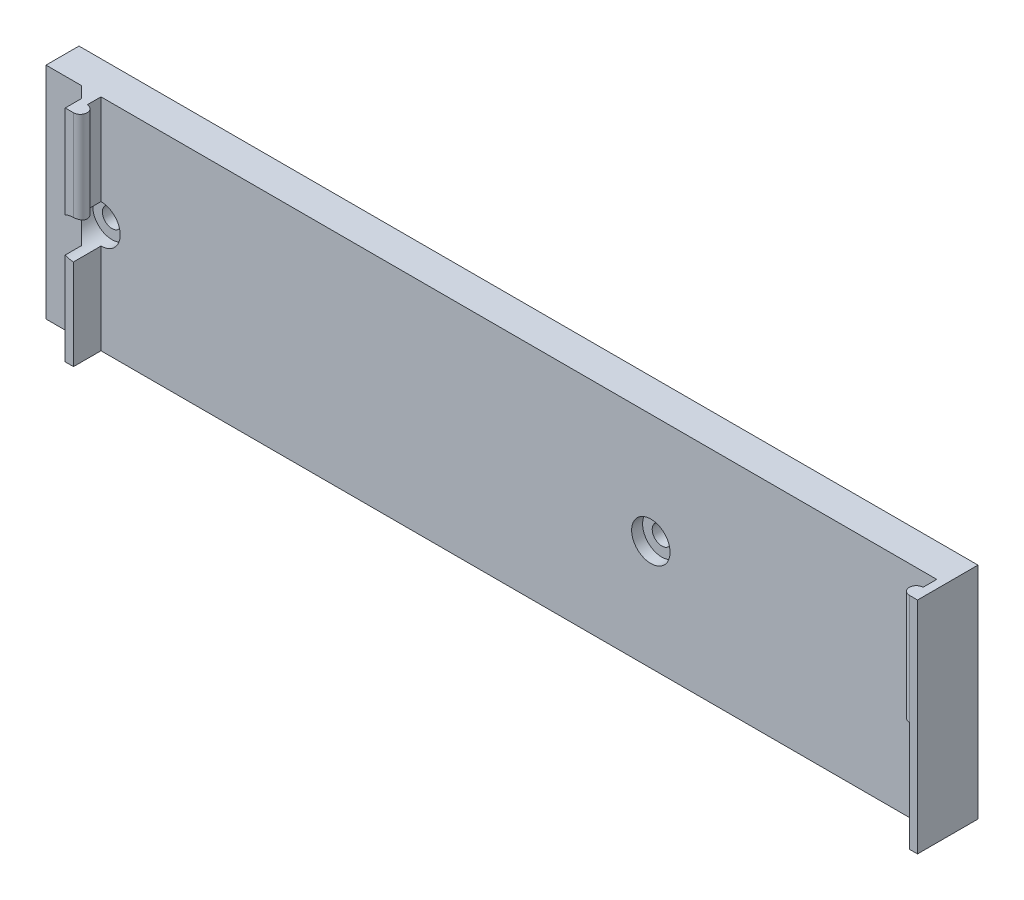
ISO-10303-21;
HEADER;
FILE_DESCRIPTION(('STEP AP214'),'2;1');
FILE_NAME('part.step','',(''),(''),'','','');
FILE_SCHEMA(('AUTOMOTIVE_DESIGN { 1 0 10303 214 1 1 1 1 }'));
ENDSEC;
DATA;
#1=APPLICATION_CONTEXT('core data for automotive mechanical design processes');
#2=APPLICATION_PROTOCOL_DEFINITION('international standard','automotive_design',2000,#1);
#3=PRODUCT_CONTEXT('',#1,'mechanical');
#4=PRODUCT('Part','Part','',(#3));
#5=PRODUCT_RELATED_PRODUCT_CATEGORY('part','',(#4));
#6=PRODUCT_DEFINITION_FORMATION('','',#4);
#7=PRODUCT_DEFINITION_CONTEXT('part definition',#1,'design');
#8=PRODUCT_DEFINITION('design','',#6,#7);
#9=PRODUCT_DEFINITION_SHAPE('','',#8);
#10=(LENGTH_UNIT() NAMED_UNIT(*) SI_UNIT(.MILLI.,.METRE.));
#11=(NAMED_UNIT(*) PLANE_ANGLE_UNIT() SI_UNIT($,.RADIAN.));
#12=(NAMED_UNIT(*) SI_UNIT($,.STERADIAN.) SOLID_ANGLE_UNIT());
#13=UNCERTAINTY_MEASURE_WITH_UNIT(LENGTH_MEASURE(1.E-05),#10,'distance_accuracy_value','');
#14=(GEOMETRIC_REPRESENTATION_CONTEXT(3) GLOBAL_UNCERTAINTY_ASSIGNED_CONTEXT((#13)) GLOBAL_UNIT_ASSIGNED_CONTEXT((#10,
#11,#12)) REPRESENTATION_CONTEXT('',''));
#15=CARTESIAN_POINT('',(0.,0.,0.));
#16=DIRECTION('',(0.,0.,1.));
#17=DIRECTION('',(1.,0.,0.));
#18=AXIS2_PLACEMENT_3D('',#15,#16,#17);
#19=CARTESIAN_POINT('',(-76.,0.,11.));
#20=DIRECTION('',(1.,0.,0.));
#21=DIRECTION('',(0.,0.,-1.));
#22=AXIS2_PLACEMENT_3D('',#19,#20,#21);
#23=PLANE('',#22);
#24=DIRECTION('',(0.,-1.,0.));
#25=VECTOR('',#24,1.);
#26=CARTESIAN_POINT('',(-76.,0.,11.));
#27=LINE('',#26,#25);
#28=CARTESIAN_POINT('',(-76.,11.5,11.));
#29=VERTEX_POINT('',#28);
#30=CARTESIAN_POINT('',(-76.,-5.00000000000002,11.));
#31=VERTEX_POINT('',#30);
#32=EDGE_CURVE('E216',#29,#31,#27,.T.);
#33=ORIENTED_EDGE('',*,*,#32,.T.);
#34=DIRECTION('',(0.,0.,1.));
#35=VECTOR('',#34,1.);
#36=CARTESIAN_POINT('',(-76.,-5.00000000000002,6.));
#37=LINE('',#36,#35);
#38=CARTESIAN_POINT('',(-76.,-5.00000000000002,6.));
#39=VERTEX_POINT('',#38);
#40=EDGE_CURVE('E477',#39,#31,#37,.T.);
#41=ORIENTED_EDGE('',*,*,#40,.F.);
#42=DIRECTION('',(0.,-1.,0.));
#43=VECTOR('',#42,1.);
#44=CARTESIAN_POINT('',(-76.,0.,6.));
#45=LINE('',#44,#43);
#46=CARTESIAN_POINT('',(-76.,11.5,6.));
#47=VERTEX_POINT('',#46);
#48=EDGE_CURVE('E210',#47,#39,#45,.T.);
#49=ORIENTED_EDGE('',*,*,#48,.F.);
#50=DIRECTION('',(0.,0.,-1.));
#51=VECTOR('',#50,1.);
#52=CARTESIAN_POINT('',(-76.,11.5,11.));
#53=LINE('',#52,#51);
#54=EDGE_CURVE('E387',#47,#29,#53,.F.);
#55=ORIENTED_EDGE('',*,*,#54,.T.);
#56=EDGE_LOOP('',(#33,#41,#49,#55));
#57=FACE_BOUND('',#56,.T.);
#58=ADVANCED_FACE('F43',(#57),#23,.T.);
#59=CARTESIAN_POINT('',(-77.5,-35.,6.));
#60=DIRECTION('',(1.,0.,0.));
#61=DIRECTION('',(0.,0.,-1.));
#62=AXIS2_PLACEMENT_3D('',#59,#60,#61);
#63=PLANE('',#62);
#64=DIRECTION('',(0.,0.,-1.));
#65=VECTOR('',#64,1.);
#66=CARTESIAN_POINT('',(-77.5,-5.00000000000002,11.));
#67=LINE('',#66,#65);
#68=CARTESIAN_POINT('',(-77.5,-5.00000000000002,11.));
#69=VERTEX_POINT('',#68);
#70=CARTESIAN_POINT('',(-77.5,-5.00000000000072,8.00000000000003));
#71=VERTEX_POINT('',#70);
#72=EDGE_CURVE('E60',#69,#71,#67,.T.);
#73=ORIENTED_EDGE('',*,*,#72,.F.);
#74=DIRECTION('',(0.,-1.,0.));
#75=VECTOR('',#74,1.);
#76=CARTESIAN_POINT('',(-77.5,0.,11.));
#77=LINE('',#76,#75);
#78=CARTESIAN_POINT('',(-77.5,11.8377223398316,11.));
#79=VERTEX_POINT('',#78);
#80=EDGE_CURVE('E220',#79,#69,#77,.T.);
#81=ORIENTED_EDGE('',*,*,#80,.F.);
#82=DIRECTION('',(0.,0.,-1.));
#83=VECTOR('',#82,1.);
#84=CARTESIAN_POINT('',(-77.5,11.8377223398316,11.));
#85=LINE('',#84,#83);
#86=CARTESIAN_POINT('',(-77.5,11.8377223398316,8.00000000000003));
#87=VERTEX_POINT('',#86);
#88=EDGE_CURVE('E383',#87,#79,#85,.F.);
#89=ORIENTED_EDGE('',*,*,#88,.F.);
#90=DIRECTION('',(0.,-1.,0.));
#91=VECTOR('',#90,1.);
#92=CARTESIAN_POINT('',(-77.5,-35.,8.00000000000003));
#93=LINE('',#92,#91);
#94=EDGE_CURVE('E249',#87,#71,#93,.T.);
#95=ORIENTED_EDGE('',*,*,#94,.T.);
#96=EDGE_LOOP('',(#73,#81,#89,#95));
#97=FACE_BOUND('',#96,.T.);
#98=ADVANCED_FACE('F349',(#97),#63,.F.);
#99=CARTESIAN_POINT('',(0.,0.,6.));
#100=DIRECTION('',(0.,0.,1.));
#101=DIRECTION('',(1.,0.,0.));
#102=AXIS2_PLACEMENT_3D('',#99,#100,#101);
#103=PLANE('',#102);
#104=CARTESIAN_POINT('',(24.,15.,6.));
#105=DIRECTION('',(0.,0.,1.));
#106=DIRECTION('',(1.,0.,0.));
#107=AXIS2_PLACEMENT_3D('',#104,#105,#106);
#108=CIRCLE('',#107,3.5);
#109=CARTESIAN_POINT('',(27.5,15.,6.));
#110=VERTEX_POINT('',#109);
#111=EDGE_CURVE('E497',#110,#110,#108,.T.);
#112=ORIENTED_EDGE('',*,*,#111,.F.);
#113=EDGE_LOOP('',(#112));
#114=FACE_BOUND('',#113,.T.);
#115=ORIENTED_EDGE('',*,*,#48,.T.);
#116=DIRECTION('',(-1.,0.,0.));
#117=VECTOR('',#116,1.);
#118=CARTESIAN_POINT('',(76.,-5.,6.));
#119=LINE('',#118,#117);
#120=CARTESIAN_POINT('',(76.,-5.,6.));
#121=VERTEX_POINT('',#120);
#122=EDGE_CURVE('E187',#121,#39,#119,.T.);
#123=ORIENTED_EDGE('',*,*,#122,.F.);
#124=DIRECTION('',(0.,1.,0.));
#125=VECTOR('',#124,1.);
#126=CARTESIAN_POINT('',(76.,0.,6.));
#127=LINE('',#126,#125);
#128=CARTESIAN_POINT('',(76.,35.,6.));
#129=VERTEX_POINT('',#128);
#130=EDGE_CURVE('E185',#121,#129,#127,.T.);
#131=ORIENTED_EDGE('',*,*,#130,.T.);
#132=DIRECTION('',(-1.,0.,0.));
#133=VECTOR('',#132,1.);
#134=CARTESIAN_POINT('',(77.5,35.,6.));
#135=LINE('',#134,#133);
#136=CARTESIAN_POINT('',(-76.,35.,6.));
#137=VERTEX_POINT('',#136);
#138=EDGE_CURVE('E233',#129,#137,#135,.T.);
#139=ORIENTED_EDGE('',*,*,#138,.T.);
#140=CARTESIAN_POINT('',(-76.,18.5,6.));
#141=VERTEX_POINT('',#140);
#142=EDGE_CURVE('E226',#137,#141,#45,.T.);
#143=ORIENTED_EDGE('',*,*,#142,.T.);
#144=CARTESIAN_POINT('',(-76.,15.,6.));
#145=DIRECTION('',(0.,0.,1.));
#146=DIRECTION('',(1.,0.,0.));
#147=AXIS2_PLACEMENT_3D('',#144,#145,#146);
#148=CIRCLE('',#147,3.5);
#149=EDGE_CURVE('E489',#47,#141,#148,.T.);
#150=ORIENTED_EDGE('',*,*,#149,.F.);
#151=EDGE_LOOP('',(#115,#123,#131,#139,#143,#150));
#152=FACE_BOUND('',#151,.T.);
#153=ADVANCED_FACE('F356',(#114,#152),#103,.T.);
#154=CARTESIAN_POINT('',(77.5,-35.,6.));
#155=DIRECTION('',(-1.,0.,0.));
#156=DIRECTION('',(0.,0.,1.));
#157=AXIS2_PLACEMENT_3D('',#154,#155,#156);
#158=PLANE('',#157);
#159=DIRECTION('',(0.,0.,1.));
#160=VECTOR('',#159,1.);
#161=CARTESIAN_POINT('',(77.5,-5.,0.));
#162=LINE('',#161,#160);
#163=CARTESIAN_POINT('',(77.5,-5.,0.));
#164=VERTEX_POINT('',#163);
#165=CARTESIAN_POINT('',(77.5,-5.,11.));
#166=VERTEX_POINT('',#165);
#167=EDGE_CURVE('E173',#164,#166,#162,.T.);
#168=ORIENTED_EDGE('',*,*,#167,.F.);
#169=DIRECTION('',(0.,1.,0.));
#170=VECTOR('',#169,1.);
#171=CARTESIAN_POINT('',(77.5,-35.,0.));
#172=LINE('',#171,#170);
#173=CARTESIAN_POINT('',(77.5,35.,0.));
#174=VERTEX_POINT('',#173);
#175=EDGE_CURVE('E232',#164,#174,#172,.T.);
#176=ORIENTED_EDGE('',*,*,#175,.T.);
#177=DIRECTION('',(0.,0.,-1.));
#178=VECTOR('',#177,1.);
#179=CARTESIAN_POINT('',(77.5,35.,6.));
#180=LINE('',#179,#178);
#181=CARTESIAN_POINT('',(77.5,35.,11.));
#182=VERTEX_POINT('',#181);
#183=EDGE_CURVE('E245',#182,#174,#180,.T.);
#184=ORIENTED_EDGE('',*,*,#183,.F.);
#185=DIRECTION('',(0.,1.,0.));
#186=VECTOR('',#185,1.);
#187=CARTESIAN_POINT('',(77.5,0.,11.));
#188=LINE('',#187,#186);
#189=EDGE_CURVE('E194',#166,#182,#188,.T.);
#190=ORIENTED_EDGE('',*,*,#189,.F.);
#191=EDGE_LOOP('',(#168,#176,#184,#190));
#192=FACE_BOUND('',#191,.T.);
#193=ADVANCED_FACE('F442',(#192),#158,.F.);
#194=CARTESIAN_POINT('',(0.,0.,0.));
#195=DIRECTION('',(0.,0.,1.));
#196=DIRECTION('',(1.,0.,0.));
#197=AXIS2_PLACEMENT_3D('',#194,#195,#196);
#198=PLANE('',#197);
#199=CARTESIAN_POINT('',(24.,15.,0.));
#200=DIRECTION('',(0.,0.,-1.));
#201=DIRECTION('',(-1.,0.,0.));
#202=AXIS2_PLACEMENT_3D('',#199,#200,#201);
#203=CIRCLE('',#202,1.75);
#204=CARTESIAN_POINT('',(22.25,15.,0.));
#205=VERTEX_POINT('',#204);
#206=EDGE_CURVE('E300',#205,#205,#203,.T.);
#207=ORIENTED_EDGE('',*,*,#206,.F.);
#208=EDGE_LOOP('',(#207));
#209=FACE_BOUND('',#208,.T.);
#210=CARTESIAN_POINT('',(-76.,15.,0.));
#211=DIRECTION('',(0.,0.,-1.));
#212=DIRECTION('',(-1.,0.,0.));
#213=AXIS2_PLACEMENT_3D('',#210,#211,#212);
#214=CIRCLE('',#213,1.75);
#215=CARTESIAN_POINT('',(-77.75,15.,0.));
#216=VERTEX_POINT('',#215);
#217=EDGE_CURVE('E294',#216,#216,#214,.T.);
#218=ORIENTED_EDGE('',*,*,#217,.F.);
#219=EDGE_LOOP('',(#218));
#220=FACE_BOUND('',#219,.T.);
#221=DIRECTION('',(1.,0.,0.));
#222=VECTOR('',#221,1.);
#223=CARTESIAN_POINT('',(-86.,-5.00000000000002,0.));
#224=LINE('',#223,#222);
#225=CARTESIAN_POINT('',(-86.,-5.00000000000002,0.));
#226=VERTEX_POINT('',#225);
#227=EDGE_CURVE('E460',#226,#164,#224,.T.);
#228=ORIENTED_EDGE('',*,*,#227,.F.);
#229=DIRECTION('',(0.,-1.,0.));
#230=VECTOR('',#229,1.);
#231=CARTESIAN_POINT('',(-86.,0.,0.));
#232=LINE('',#231,#230);
#233=CARTESIAN_POINT('',(-86.,35.,0.));
#234=VERTEX_POINT('',#233);
#235=EDGE_CURVE('E303',#234,#226,#232,.T.);
#236=ORIENTED_EDGE('',*,*,#235,.F.);
#237=DIRECTION('',(-1.,0.,0.));
#238=VECTOR('',#237,1.);
#239=CARTESIAN_POINT('',(77.5,35.,0.));
#240=LINE('',#239,#238);
#241=EDGE_CURVE('E238',#174,#234,#240,.T.);
#242=ORIENTED_EDGE('',*,*,#241,.F.);
#243=ORIENTED_EDGE('',*,*,#175,.F.);
#244=EDGE_LOOP('',(#228,#236,#242,#243));
#245=FACE_BOUND('',#244,.T.);
#246=ADVANCED_FACE('F437',(#209,#220,#245),#198,.F.);
#247=CARTESIAN_POINT('',(0.,0.,11.));
#248=DIRECTION('',(0.,0.,1.));
#249=DIRECTION('',(1.,0.,0.));
#250=AXIS2_PLACEMENT_3D('',#247,#248,#249);
#251=PLANE('',#250);
#252=ORIENTED_EDGE('',*,*,#80,.T.);
#253=DIRECTION('',(-1.,0.,0.));
#254=VECTOR('',#253,1.);
#255=CARTESIAN_POINT('',(-76.,-5.00000000000002,11.));
#256=LINE('',#255,#254);
#257=EDGE_CURVE('E474',#31,#69,#256,.T.);
#258=ORIENTED_EDGE('',*,*,#257,.F.);
#259=ORIENTED_EDGE('',*,*,#32,.F.);
#260=CARTESIAN_POINT('',(-76.,15.,11.));
#261=DIRECTION('',(0.,0.,1.));
#262=DIRECTION('',(1.,0.,0.));
#263=AXIS2_PLACEMENT_3D('',#260,#261,#262);
#264=CIRCLE('',#263,3.50000000000001);
#265=EDGE_CURVE('E455',#79,#29,#264,.T.);
#266=ORIENTED_EDGE('',*,*,#265,.F.);
#267=EDGE_LOOP('',(#252,#258,#259,#266));
#268=FACE_BOUND('',#267,.T.);
#269=ADVANCED_FACE('F434',(#268),#251,.T.);
#270=CARTESIAN_POINT('',(76.,0.,11.));
#271=DIRECTION('',(-1.,0.,0.));
#272=DIRECTION('',(0.,0.,1.));
#273=AXIS2_PLACEMENT_3D('',#270,#271,#272);
#274=PLANE('',#273);
#275=ORIENTED_EDGE('',*,*,#130,.F.);
#276=DIRECTION('',(0.,0.,-1.));
#277=VECTOR('',#276,1.);
#278=CARTESIAN_POINT('',(76.,-5.,11.));
#279=LINE('',#278,#277);
#280=CARTESIAN_POINT('',(76.,-5.,11.));
#281=VERTEX_POINT('',#280);
#282=EDGE_CURVE('E170',#281,#121,#279,.T.);
#283=ORIENTED_EDGE('',*,*,#282,.F.);
#284=DIRECTION('',(0.,1.,0.));
#285=VECTOR('',#284,1.);
#286=CARTESIAN_POINT('',(76.,0.,11.));
#287=LINE('',#286,#285);
#288=CARTESIAN_POINT('',(76.,15.,11.));
#289=VERTEX_POINT('',#288);
#290=EDGE_CURVE('E182',#281,#289,#287,.T.);
#291=ORIENTED_EDGE('',*,*,#290,.T.);
#292=DIRECTION('',(0.,0.,1.));
#293=VECTOR('',#292,1.);
#294=CARTESIAN_POINT('',(76.,15.,0.));
#295=LINE('',#294,#293);
#296=CARTESIAN_POINT('',(76.,15.,8.5));
#297=VERTEX_POINT('',#296);
#298=EDGE_CURVE('E316',#297,#289,#295,.T.);
#299=ORIENTED_EDGE('',*,*,#298,.F.);
#300=DIRECTION('',(0.,1.,0.));
#301=VECTOR('',#300,1.);
#302=CARTESIAN_POINT('',(76.,15.,8.5));
#303=LINE('',#302,#301);
#304=CARTESIAN_POINT('',(76.,35.,8.5));
#305=VERTEX_POINT('',#304);
#306=EDGE_CURVE('E202',#297,#305,#303,.T.);
#307=ORIENTED_EDGE('',*,*,#306,.T.);
#308=DIRECTION('',(0.,0.,-1.));
#309=VECTOR('',#308,1.);
#310=CARTESIAN_POINT('',(76.,35.,11.));
#311=LINE('',#310,#309);
#312=EDGE_CURVE('E206',#305,#129,#311,.T.);
#313=ORIENTED_EDGE('',*,*,#312,.T.);
#314=EDGE_LOOP('',(#275,#283,#291,#299,#307,#313));
#315=FACE_BOUND('',#314,.T.);
#316=ADVANCED_FACE('F181',(#315),#274,.T.);
#317=CARTESIAN_POINT('',(0.,0.,11.));
#318=DIRECTION('',(0.,0.,1.));
#319=DIRECTION('',(1.,0.,0.));
#320=AXIS2_PLACEMENT_3D('',#317,#318,#319);
#321=PLANE('',#320);
#322=ORIENTED_EDGE('',*,*,#290,.F.);
#323=DIRECTION('',(-1.,0.,0.));
#324=VECTOR('',#323,1.);
#325=CARTESIAN_POINT('',(77.5,-5.,11.));
#326=LINE('',#325,#324);
#327=EDGE_CURVE('E167',#166,#281,#326,.T.);
#328=ORIENTED_EDGE('',*,*,#327,.F.);
#329=ORIENTED_EDGE('',*,*,#189,.T.);
#330=DIRECTION('',(-1.,0.,0.));
#331=VECTOR('',#330,1.);
#332=CARTESIAN_POINT('',(0.,35.,11.));
#333=LINE('',#332,#331);
#334=CARTESIAN_POINT('',(76.,35.,11.));
#335=VERTEX_POINT('',#334);
#336=EDGE_CURVE('E198',#182,#335,#333,.T.);
#337=ORIENTED_EDGE('',*,*,#336,.T.);
#338=DIRECTION('',(0.,1.,0.));
#339=VECTOR('',#338,1.);
#340=CARTESIAN_POINT('',(76.,15.,11.));
#341=LINE('',#340,#339);
#342=EDGE_CURVE('E191',#289,#335,#341,.T.);
#343=ORIENTED_EDGE('',*,*,#342,.F.);
#344=EDGE_LOOP('',(#322,#328,#329,#337,#343));
#345=FACE_BOUND('',#344,.T.);
#346=ADVANCED_FACE('F189',(#345),#321,.T.);
#347=CARTESIAN_POINT('',(0.,0.,6.));
#348=DIRECTION('',(0.,0.,1.));
#349=DIRECTION('',(1.,0.,0.));
#350=AXIS2_PLACEMENT_3D('',#347,#348,#349);
#351=PLANE('',#350);
#352=DIRECTION('',(0.,-1.,0.));
#353=VECTOR('',#352,1.);
#354=CARTESIAN_POINT('',(-86.,0.,6.00000000000001));
#355=LINE('',#354,#353);
#356=CARTESIAN_POINT('',(-86.,35.,6.00000000000001));
#357=VERTEX_POINT('',#356);
#358=CARTESIAN_POINT('',(-86.,-5.00000000000002,6.00000000000001));
#359=VERTEX_POINT('',#358);
#360=EDGE_CURVE('E293',#357,#359,#355,.T.);
#361=ORIENTED_EDGE('',*,*,#360,.T.);
#362=DIRECTION('',(-1.,0.,0.));
#363=VECTOR('',#362,1.);
#364=CARTESIAN_POINT('',(-79.5,-5.00000000000002,6.00000000000001));
#365=LINE('',#364,#363);
#366=CARTESIAN_POINT('',(-79.5,-5.00000000000002,6.00000000000001));
#367=VERTEX_POINT('',#366);
#368=EDGE_CURVE('E466',#367,#359,#365,.T.);
#369=ORIENTED_EDGE('',*,*,#368,.F.);
#370=DIRECTION('',(0.,1.,0.));
#371=VECTOR('',#370,1.);
#372=CARTESIAN_POINT('',(-79.5,0.,6.));
#373=LINE('',#372,#371);
#374=CARTESIAN_POINT('',(-79.5,15.,6.));
#375=VERTEX_POINT('',#374);
#376=EDGE_CURVE('E256',#367,#375,#373,.T.);
#377=ORIENTED_EDGE('',*,*,#376,.T.);
#378=DIRECTION('',(0.,1.,0.));
#379=VECTOR('',#378,1.);
#380=CARTESIAN_POINT('',(-79.5,0.,6.));
#381=LINE('',#380,#379);
#382=CARTESIAN_POINT('',(-79.5,35.,6.00000000000001));
#383=VERTEX_POINT('',#382);
#384=EDGE_CURVE('E253',#375,#383,#381,.T.);
#385=ORIENTED_EDGE('',*,*,#384,.T.);
#386=DIRECTION('',(-1.,0.,0.));
#387=VECTOR('',#386,1.);
#388=CARTESIAN_POINT('',(0.,35.,6.00000000000001));
#389=LINE('',#388,#387);
#390=EDGE_CURVE('E285',#383,#357,#389,.T.);
#391=ORIENTED_EDGE('',*,*,#390,.T.);
#392=EDGE_LOOP('',(#361,#369,#377,#385,#391));
#393=FACE_BOUND('',#392,.T.);
#394=ADVANCED_FACE('F284',(#393),#351,.T.);
#395=CARTESIAN_POINT('',(-86.,0.,183.854575426105));
#396=DIRECTION('',(1.,0.,0.));
#397=DIRECTION('',(0.,1.,0.));
#398=AXIS2_PLACEMENT_3D('',#395,#396,#397);
#399=PLANE('',#398);
#400=DIRECTION('',(0.,0.,-1.));
#401=VECTOR('',#400,1.);
#402=CARTESIAN_POINT('',(-86.,-5.00000000000002,6.00000000000001));
#403=LINE('',#402,#401);
#404=EDGE_CURVE('E463',#359,#226,#403,.T.);
#405=ORIENTED_EDGE('',*,*,#404,.F.);
#406=ORIENTED_EDGE('',*,*,#360,.F.);
#407=DIRECTION('',(0.,0.,-1.));
#408=VECTOR('',#407,1.);
#409=CARTESIAN_POINT('',(-86.,35.,183.854575426105));
#410=LINE('',#409,#408);
#411=EDGE_CURVE('E290',#357,#234,#410,.T.);
#412=ORIENTED_EDGE('',*,*,#411,.T.);
#413=ORIENTED_EDGE('',*,*,#235,.T.);
#414=EDGE_LOOP('',(#405,#406,#412,#413));
#415=FACE_BOUND('',#414,.T.);
#416=ADVANCED_FACE('F371',(#415),#399,.F.);
#417=CARTESIAN_POINT('',(-77.5,-35.,8.00000000000003));
#418=DIRECTION('',(0.707106781186552,0.,-0.707106781186542));
#419=DIRECTION('',(0.,-1.,0.));
#420=AXIS2_PLACEMENT_3D('',#417,#418,#419);
#421=PLANE('',#420);
#422=DIRECTION('',(-0.707106781186543,0.,-0.707106781186551));
#423=VECTOR('',#422,1.);
#424=CARTESIAN_POINT('',(-77.5,-5.00000000000002,8.00000000000003));
#425=LINE('',#424,#423);
#426=EDGE_CURVE('E469',#71,#367,#425,.T.);
#427=ORIENTED_EDGE('',*,*,#426,.F.);
#428=ORIENTED_EDGE('',*,*,#94,.F.);
#429=CARTESIAN_POINT('',(-76.,15.,9.50000000000007));
#430=DIRECTION('',(0.707106781186552,0.,-0.707106781186542));
#431=DIRECTION('',(0.707106781186543,0.,0.707106781186552));
#432=AXIS2_PLACEMENT_3D('',#429,#430,#431);
#433=ELLIPSE('',#432,4.94974746830587,3.5);
#434=EDGE_CURVE('E263',#375,#87,#433,.F.);
#435=ORIENTED_EDGE('',*,*,#434,.F.);
#436=ORIENTED_EDGE('',*,*,#376,.F.);
#437=EDGE_LOOP('',(#427,#428,#435,#436));
#438=FACE_BOUND('',#437,.T.);
#439=ADVANCED_FACE('F281',(#438),#421,.F.);
#440=DIRECTION('',(0.,1.,0.));
#441=VECTOR('',#440,1.);
#442=CARTESIAN_POINT('',(-76.,15.,8.5));
#443=LINE('',#442,#441);
#444=CARTESIAN_POINT('',(-76.,18.5,8.5));
#445=VERTEX_POINT('',#444);
#446=CARTESIAN_POINT('',(-76.,35.,8.5));
#447=VERTEX_POINT('',#446);
#448=EDGE_CURVE('E312',#445,#447,#443,.T.);
#449=ORIENTED_EDGE('',*,*,#448,.F.);
#450=DIRECTION('',(0.,0.,-1.));
#451=VECTOR('',#450,1.);
#452=CARTESIAN_POINT('',(-76.,18.5,11.));
#453=LINE('',#452,#451);
#454=EDGE_CURVE('E375',#445,#141,#453,.T.);
#455=ORIENTED_EDGE('',*,*,#454,.T.);
#456=ORIENTED_EDGE('',*,*,#142,.F.);
#457=DIRECTION('',(0.,0.,-1.));
#458=VECTOR('',#457,1.);
#459=CARTESIAN_POINT('',(-76.,35.,11.));
#460=LINE('',#459,#458);
#461=EDGE_CURVE('E225',#447,#137,#460,.T.);
#462=ORIENTED_EDGE('',*,*,#461,.F.);
#463=EDGE_LOOP('',(#449,#455,#456,#462));
#464=FACE_BOUND('',#463,.T.);
#465=ADVANCED_FACE('F352',(#464),#23,.T.);
#466=DIRECTION('',(0.,0.,-1.));
#467=VECTOR('',#466,1.);
#468=CARTESIAN_POINT('',(-77.5,35.,6.));
#469=LINE('',#468,#467);
#470=CARTESIAN_POINT('',(-77.5,35.,11.));
#471=VERTEX_POINT('',#470);
#472=CARTESIAN_POINT('',(-77.5,35.,8.00000000000003));
#473=VERTEX_POINT('',#472);
#474=EDGE_CURVE('E237',#471,#473,#469,.T.);
#475=ORIENTED_EDGE('',*,*,#474,.T.);
#476=DIRECTION('',(0.,-1.,0.));
#477=VECTOR('',#476,1.);
#478=CARTESIAN_POINT('',(-77.5,-35.,8.00000000000003));
#479=LINE('',#478,#477);
#480=CARTESIAN_POINT('',(-77.5,18.1622776601683,8.00000000000003));
#481=VERTEX_POINT('',#480);
#482=EDGE_CURVE('E259',#473,#481,#479,.T.);
#483=ORIENTED_EDGE('',*,*,#482,.T.);
#484=DIRECTION('',(0.,0.,-1.));
#485=VECTOR('',#484,1.);
#486=CARTESIAN_POINT('',(-77.5,18.1622776601683,11.));
#487=LINE('',#486,#485);
#488=CARTESIAN_POINT('',(-77.5,18.1622776601683,11.));
#489=VERTEX_POINT('',#488);
#490=EDGE_CURVE('E274',#489,#481,#487,.T.);
#491=ORIENTED_EDGE('',*,*,#490,.F.);
#492=EDGE_CURVE('E221',#471,#489,#77,.T.);
#493=ORIENTED_EDGE('',*,*,#492,.F.);
#494=EDGE_LOOP('',(#475,#483,#491,#493));
#495=FACE_BOUND('',#494,.T.);
#496=ADVANCED_FACE('F359',(#495),#63,.F.);
#497=CARTESIAN_POINT('',(-76.,15.,9.75));
#498=DIRECTION('',(0.,1.,0.));
#499=DIRECTION('',(-1.,0.,0.));
#500=AXIS2_PLACEMENT_3D('',#497,#498,#499);
#501=CYLINDRICAL_SURFACE('',#500,1.25);
#502=CARTESIAN_POINT('',(-76.,18.5,8.5));
#503=CARTESIAN_POINT('',(-75.9659757904319,18.5000026683283,8.49999907683071));
#504=CARTESIAN_POINT('',(-75.9319688547805,18.4995032816792,8.50139008495954));
#505=CARTESIAN_POINT('',(-75.864217584946,18.4975289487794,8.50693175917107));
#506=CARTESIAN_POINT('',(-75.8304731865727,18.4960542490934,8.51108172777475));
#507=CARTESIAN_POINT('',(-75.7302073943591,18.4902245695908,8.5275924385276));
#508=CARTESIAN_POINT('',(-75.6643885949796,18.4844635651872,8.54401442577793));
#509=CARTESIAN_POINT('',(-75.5366547082636,18.4697918359865,8.58708958889776));
#510=CARTESIAN_POINT('',(-75.4747377608142,18.4608826256113,8.61373784602236));
#511=CARTESIAN_POINT('',(-75.3562241417227,18.440809192101,8.67643185981238));
#512=CARTESIAN_POINT('',(-75.2996305798288,18.4296436627403,8.71248306355123));
#513=CARTESIAN_POINT('',(-75.1912060790333,18.4057370816355,8.79442096281969));
#514=CARTESIAN_POINT('',(-75.1396113591823,18.392954546177,8.84060790552855));
#515=CARTESIAN_POINT('',(-75.0447105996287,18.3674680187645,8.94087143656938));
#516=CARTESIAN_POINT('',(-75.0014070313663,18.3547640513187,8.99495036891979));
#517=CARTESIAN_POINT('',(-74.922880473595,18.3304001061877,9.11170007488475));
#518=CARTESIAN_POINT('',(-74.8879809552402,18.3187900803079,9.17459986308374));
#519=CARTESIAN_POINT('',(-74.8293612147054,18.2985714206393,9.3058545348867));
#520=CARTESIAN_POINT('',(-74.8056365584818,18.289961596762,9.37420724223113));
#521=CARTESIAN_POINT('',(-74.770954515659,18.2771602545628,9.51171073731794));
#522=CARTESIAN_POINT('',(-74.7595476309359,18.2728137537401,9.58073326043892));
#523=CARTESIAN_POINT('',(-74.7484192355344,18.2685753081462,9.71984040223422));
#524=CARTESIAN_POINT('',(-74.7486936919814,18.2686818260114,9.78992464600614));
#525=CARTESIAN_POINT('',(-74.7605746424022,18.273202956084,9.92517826816106));
#526=CARTESIAN_POINT('',(-74.7715743349314,18.2773868746983,9.99041004961843));
#527=CARTESIAN_POINT('',(-74.8035960297355,18.289210512782,10.1180315991849));
#528=CARTESIAN_POINT('',(-74.8246192674017,18.2968506582217,10.1804210159368));
#529=CARTESIAN_POINT('',(-74.8764521600179,18.3148758556283,10.3018868924054));
#530=CARTESIAN_POINT('',(-74.9074289864255,18.3253072461456,10.3608848378626));
#531=CARTESIAN_POINT('',(-74.9781737204176,18.3477223570999,10.4730282359576));
#532=CARTESIAN_POINT('',(-75.0179444487767,18.3597065751175,10.5261718025031));
#533=CARTESIAN_POINT('',(-75.1079806205524,18.3847615419392,10.6284758978067));
#534=CARTESIAN_POINT('',(-75.1587350177102,18.3978541865051,10.6772016768853));
#535=CARTESIAN_POINT('',(-75.2678612729399,18.4230255783854,10.7655800316741));
#536=CARTESIAN_POINT('',(-75.3262352118476,18.4351040472505,10.8052301207113));
#537=CARTESIAN_POINT('',(-75.4499807941009,18.4570910587843,10.8747592459903));
#538=CARTESIAN_POINT('',(-75.5154353921905,18.4669685082592,10.9045008936965));
#539=CARTESIAN_POINT('',(-75.6508270205677,18.4832028361184,10.9523787560176));
#540=CARTESIAN_POINT('',(-75.7207572036335,18.4895649554513,10.9705322535262));
#541=CARTESIAN_POINT('',(-75.8261479716852,18.4958506132377,10.988344283457));
#542=CARTESIAN_POINT('',(-75.860776369585,18.4974025097797,10.9927127455016));
#543=CARTESIAN_POINT('',(-75.9302635093121,18.4994779139932,10.9985390828793));
#544=CARTESIAN_POINT('',(-75.9651219053432,18.5000027168634,11.0000006239726));
#545=CARTESIAN_POINT('',(-76.,18.5000000000001,11.0000000000002));
#546=B_SPLINE_CURVE_WITH_KNOTS('',3,(#502,#503,#504,#505,#506,#507,#508,#509,#510,#511,#512,
#513,#514,#515,#516,#517,#518,#519,#520,#521,#522,#523,#524,#525,#526,#527,#528,#529,#530,#531,
#532,#533,#534,#535,#536,#537,#538,#539,#540,#541,#542,#543,#544,#545),.UNSPECIFIED.,.F.,.F.,(4,
2,2,2,2,2,2,2,2,2,2,2,2,2,2,2,2,2,2,2,2,4),(0.,0.102006778343278,0.203987778663533,
0.407165932526253,0.610246481746047,0.813444936675671,1.02375999820424,1.23413765352075,
1.45164280743171,1.66906158520247,1.8782461980126,2.08735859236272,2.2852880405023,
2.48324188954616,2.68471130666592,2.88624544208698,3.09995801092077,3.31372906553626,
3.53035156417599,3.7466502263919,3.85134354778704,3.9559047622036),.UNSPECIFIED.);
#547=CARTESIAN_POINT('',(-76.,18.5,11.));
#548=VERTEX_POINT('',#547);
#549=EDGE_CURVE('E379',#445,#548,#546,.T.);
#550=ORIENTED_EDGE('',*,*,#549,.F.);
#551=ORIENTED_EDGE('',*,*,#448,.T.);
#552=CARTESIAN_POINT('',(-76.,35.,9.75));
#553=DIRECTION('',(0.,-1.,0.));
#554=DIRECTION('',(1.,0.,0.));
#555=AXIS2_PLACEMENT_3D('',#552,#553,#554);
#556=CIRCLE('',#555,1.25);
#557=CARTESIAN_POINT('',(-76.,35.,11.));
#558=VERTEX_POINT('',#557);
#559=EDGE_CURVE('E308',#447,#558,#556,.T.);
#560=ORIENTED_EDGE('',*,*,#559,.T.);
#561=EDGE_CURVE('E211',#558,#548,#27,.T.);
#562=ORIENTED_EDGE('',*,*,#561,.T.);
#563=EDGE_LOOP('',(#550,#551,#560,#562));
#564=FACE_BOUND('',#563,.T.);
#565=ADVANCED_FACE('F369',(#564),#501,.T.);
#566=ORIENTED_EDGE('',*,*,#492,.T.);
#567=EDGE_CURVE('E452',#548,#489,#264,.T.);
#568=ORIENTED_EDGE('',*,*,#567,.F.);
#569=ORIENTED_EDGE('',*,*,#561,.F.);
#570=DIRECTION('',(-1.,0.,0.));
#571=VECTOR('',#570,1.);
#572=CARTESIAN_POINT('',(0.,35.,11.));
#573=LINE('',#572,#571);
#574=EDGE_CURVE('E215',#558,#471,#573,.T.);
#575=ORIENTED_EDGE('',*,*,#574,.T.);
#576=EDGE_LOOP('',(#566,#568,#569,#575));
#577=FACE_BOUND('',#576,.T.);
#578=ADVANCED_FACE('F345',(#577),#251,.T.);
#579=CARTESIAN_POINT('',(77.5,35.,6.));
#580=DIRECTION('',(0.,-1.,0.));
#581=DIRECTION('',(1.,0.,0.));
#582=AXIS2_PLACEMENT_3D('',#579,#580,#581);
#583=PLANE('',#582);
#584=ORIENTED_EDGE('',*,*,#461,.T.);
#585=ORIENTED_EDGE('',*,*,#138,.F.);
#586=ORIENTED_EDGE('',*,*,#312,.F.);
#587=CARTESIAN_POINT('',(76.,35.,9.75));
#588=DIRECTION('',(0.,1.,0.));
#589=DIRECTION('',(-1.,0.,0.));
#590=AXIS2_PLACEMENT_3D('',#587,#588,#589);
#591=CIRCLE('',#590,1.25);
#592=EDGE_CURVE('E315',#305,#335,#591,.T.);
#593=ORIENTED_EDGE('',*,*,#592,.T.);
#594=ORIENTED_EDGE('',*,*,#336,.F.);
#595=ORIENTED_EDGE('',*,*,#183,.T.);
#596=ORIENTED_EDGE('',*,*,#241,.T.);
#597=ORIENTED_EDGE('',*,*,#411,.F.);
#598=ORIENTED_EDGE('',*,*,#390,.F.);
#599=DIRECTION('',(0.707106781186543,0.,0.707106781186552));
#600=VECTOR('',#599,1.);
#601=CARTESIAN_POINT('',(-1.0000000000011,35.,84.5));
#602=LINE('',#601,#600);
#603=EDGE_CURVE('E11',#383,#473,#602,.T.);
#604=ORIENTED_EDGE('',*,*,#603,.T.);
#605=ORIENTED_EDGE('',*,*,#474,.F.);
#606=ORIENTED_EDGE('',*,*,#574,.F.);
#607=ORIENTED_EDGE('',*,*,#559,.F.);
#608=EDGE_LOOP('',(#584,#585,#586,#593,#594,#595,#596,#597,#598,#604,#605,#606,#607));
#609=FACE_BOUND('',#608,.T.);
#610=ADVANCED_FACE('F288',(#609),#583,.F.);
#611=CARTESIAN_POINT('',(76.,15.,9.75));
#612=DIRECTION('',(0.,1.,0.));
#613=DIRECTION('',(-1.,0.,0.));
#614=AXIS2_PLACEMENT_3D('',#611,#612,#613);
#615=CYLINDRICAL_SURFACE('',#614,1.25);
#616=ORIENTED_EDGE('',*,*,#592,.F.);
#617=ORIENTED_EDGE('',*,*,#306,.F.);
#618=CARTESIAN_POINT('',(76.,15.,9.75));
#619=DIRECTION('',(0.,1.,0.));
#620=DIRECTION('',(-1.,0.,0.));
#621=AXIS2_PLACEMENT_3D('',#618,#619,#620);
#622=CIRCLE('',#621,1.25);
#623=EDGE_CURVE('E319',#297,#289,#622,.T.);
#624=ORIENTED_EDGE('',*,*,#623,.T.);
#625=ORIENTED_EDGE('',*,*,#342,.T.);
#626=EDGE_LOOP('',(#616,#617,#624,#625));
#627=FACE_BOUND('',#626,.T.);
#628=ADVANCED_FACE('F334',(#627),#615,.T.);
#629=CARTESIAN_POINT('',(0.,15.,0.));
#630=DIRECTION('',(0.,1.,0.));
#631=DIRECTION('',(-1.,0.,0.));
#632=AXIS2_PLACEMENT_3D('',#629,#630,#631);
#633=PLANE('',#632);
#634=ORIENTED_EDGE('',*,*,#298,.T.);
#635=ORIENTED_EDGE('',*,*,#623,.F.);
#636=EDGE_LOOP('',(#634,#635));
#637=FACE_BOUND('',#636,.T.);
#638=ADVANCED_FACE('F336',(#637),#633,.F.);
#639=CARTESIAN_POINT('',(-76.,15.,11.));
#640=DIRECTION('',(0.,0.,-1.));
#641=DIRECTION('',(-1.,0.,0.));
#642=AXIS2_PLACEMENT_3D('',#639,#640,#641);
#643=CYLINDRICAL_SURFACE('',#642,1.75);
#644=CARTESIAN_POINT('',(-76.,15.,4.));
#645=DIRECTION('',(0.,0.,1.));
#646=DIRECTION('',(1.,0.,0.));
#647=AXIS2_PLACEMENT_3D('',#644,#645,#646);
#648=CIRCLE('',#647,1.75000000000002);
#649=CARTESIAN_POINT('',(-74.25,15.,4.));
#650=VERTEX_POINT('',#649);
#651=EDGE_CURVE('E516',#650,#650,#648,.T.);
#652=ORIENTED_EDGE('',*,*,#651,.T.);
#653=EDGE_LOOP('',(#652));
#654=FACE_BOUND('',#653,.T.);
#655=ORIENTED_EDGE('',*,*,#217,.T.);
#656=EDGE_LOOP('',(#655));
#657=FACE_BOUND('',#656,.T.);
#658=ADVANCED_FACE('F342',(#654,#657),#643,.F.);
#659=CARTESIAN_POINT('',(24.,15.,11.));
#660=DIRECTION('',(0.,0.,-1.));
#661=DIRECTION('',(-1.,0.,0.));
#662=AXIS2_PLACEMENT_3D('',#659,#660,#661);
#663=CYLINDRICAL_SURFACE('',#662,1.75);
#664=CARTESIAN_POINT('',(24.,15.,4.));
#665=DIRECTION('',(0.,0.,1.));
#666=DIRECTION('',(1.,0.,0.));
#667=AXIS2_PLACEMENT_3D('',#664,#665,#666);
#668=CIRCLE('',#667,1.75000000000001);
#669=CARTESIAN_POINT('',(25.75,15.,4.));
#670=VERTEX_POINT('',#669);
#671=EDGE_CURVE('E506',#670,#670,#668,.T.);
#672=ORIENTED_EDGE('',*,*,#671,.T.);
#673=EDGE_LOOP('',(#672));
#674=FACE_BOUND('',#673,.T.);
#675=ORIENTED_EDGE('',*,*,#206,.T.);
#676=EDGE_LOOP('',(#675));
#677=FACE_BOUND('',#676,.T.);
#678=ADVANCED_FACE('F417',(#674,#677),#663,.F.);
#679=CARTESIAN_POINT('',(-74.25,15.,4.));
#680=DIRECTION('',(0.,0.,-1.));
#681=DIRECTION('',(-1.,0.,0.));
#682=AXIS2_PLACEMENT_3D('',#679,#680,#681);
#683=PLANE('',#682);
#684=ORIENTED_EDGE('',*,*,#651,.F.);
#685=EDGE_LOOP('',(#684));
#686=FACE_BOUND('',#685,.T.);
#687=CARTESIAN_POINT('',(-76.,15.,4.));
#688=DIRECTION('',(0.,0.,1.));
#689=DIRECTION('',(1.,0.,0.));
#690=AXIS2_PLACEMENT_3D('',#687,#688,#689);
#691=CIRCLE('',#690,3.5);
#692=CARTESIAN_POINT('',(-72.5,15.,4.));
#693=VERTEX_POINT('',#692);
#694=EDGE_CURVE('E512',#693,#693,#691,.T.);
#695=ORIENTED_EDGE('',*,*,#694,.T.);
#696=EDGE_LOOP('',(#695));
#697=FACE_BOUND('',#696,.T.);
#698=ADVANCED_FACE('F413',(#686,#697),#683,.F.);
#699=CARTESIAN_POINT('',(-76.,15.,6.));
#700=DIRECTION('',(0.,0.,1.));
#701=DIRECTION('',(1.,0.,0.));
#702=AXIS2_PLACEMENT_3D('',#699,#700,#701);
#703=CYLINDRICAL_SURFACE('',#702,3.5);
#704=ORIENTED_EDGE('',*,*,#694,.F.);
#705=EDGE_LOOP('',(#704));
#706=FACE_BOUND('',#705,.T.);
#707=ORIENTED_EDGE('',*,*,#149,.T.);
#708=ORIENTED_EDGE('',*,*,#454,.F.);
#709=ORIENTED_EDGE('',*,*,#549,.T.);
#710=ORIENTED_EDGE('',*,*,#567,.T.);
#711=ORIENTED_EDGE('',*,*,#490,.T.);
#712=CARTESIAN_POINT('',(-76.,15.,9.50000000000007));
#713=DIRECTION('',(0.707106781186552,0.,-0.707106781186542));
#714=DIRECTION('',(0.707106781186543,0.,0.707106781186552));
#715=AXIS2_PLACEMENT_3D('',#712,#713,#714);
#716=ELLIPSE('',#715,4.94974746830587,3.5);
#717=EDGE_CURVE('E53',#481,#375,#716,.F.);
#718=ORIENTED_EDGE('',*,*,#717,.T.);
#719=ORIENTED_EDGE('',*,*,#434,.T.);
#720=ORIENTED_EDGE('',*,*,#88,.T.);
#721=ORIENTED_EDGE('',*,*,#265,.T.);
#722=ORIENTED_EDGE('',*,*,#54,.F.);
#723=EDGE_LOOP('',(#707,#708,#709,#710,#711,#718,#719,#720,#721,#722));
#724=FACE_BOUND('',#723,.T.);
#725=ADVANCED_FACE('F271',(#706,#724),#703,.F.);
#726=CARTESIAN_POINT('',(25.75,15.,4.));
#727=DIRECTION('',(0.,0.,-1.));
#728=DIRECTION('',(-1.,0.,0.));
#729=AXIS2_PLACEMENT_3D('',#726,#727,#728);
#730=PLANE('',#729);
#731=ORIENTED_EDGE('',*,*,#671,.F.);
#732=EDGE_LOOP('',(#731));
#733=FACE_BOUND('',#732,.T.);
#734=CARTESIAN_POINT('',(24.,15.,4.));
#735=DIRECTION('',(0.,0.,1.));
#736=DIRECTION('',(1.,0.,0.));
#737=AXIS2_PLACEMENT_3D('',#734,#735,#736);
#738=CIRCLE('',#737,3.5);
#739=CARTESIAN_POINT('',(27.5,15.,4.));
#740=VERTEX_POINT('',#739);
#741=EDGE_CURVE('E500',#740,#740,#738,.T.);
#742=ORIENTED_EDGE('',*,*,#741,.T.);
#743=EDGE_LOOP('',(#742));
#744=FACE_BOUND('',#743,.T.);
#745=ADVANCED_FACE('F406',(#733,#744),#730,.F.);
#746=CARTESIAN_POINT('',(24.,15.,6.));
#747=DIRECTION('',(0.,0.,1.));
#748=DIRECTION('',(1.,0.,0.));
#749=AXIS2_PLACEMENT_3D('',#746,#747,#748);
#750=CYLINDRICAL_SURFACE('',#749,3.5);
#751=ORIENTED_EDGE('',*,*,#741,.F.);
#752=EDGE_LOOP('',(#751));
#753=FACE_BOUND('',#752,.T.);
#754=ORIENTED_EDGE('',*,*,#111,.T.);
#755=EDGE_LOOP('',(#754));
#756=FACE_BOUND('',#755,.T.);
#757=ADVANCED_FACE('F403',(#753,#756),#750,.F.);
#758=CARTESIAN_POINT('',(-77.5,-35.,8.00000000000003));
#759=DIRECTION('',(0.707106781186552,0.,-0.707106781186542));
#760=DIRECTION('',(0.,-1.,0.));
#761=AXIS2_PLACEMENT_3D('',#758,#759,#760);
#762=PLANE('',#761);
#763=ORIENTED_EDGE('',*,*,#603,.F.);
#764=ORIENTED_EDGE('',*,*,#384,.F.);
#765=ORIENTED_EDGE('',*,*,#717,.F.);
#766=ORIENTED_EDGE('',*,*,#482,.F.);
#767=EDGE_LOOP('',(#763,#764,#765,#766));
#768=FACE_BOUND('',#767,.T.);
#769=ADVANCED_FACE('F46',(#768),#762,.F.);
#770=CARTESIAN_POINT('',(1.57878489254493E-13,-5.00000000000036,0.));
#771=DIRECTION('',(0.,-1.,0.));
#772=DIRECTION('',(1.,0.,0.));
#773=AXIS2_PLACEMENT_3D('',#770,#771,#772);
#774=PLANE('',#773);
#775=ORIENTED_EDGE('',*,*,#327,.T.);
#776=ORIENTED_EDGE('',*,*,#282,.T.);
#777=ORIENTED_EDGE('',*,*,#122,.T.);
#778=ORIENTED_EDGE('',*,*,#40,.T.);
#779=ORIENTED_EDGE('',*,*,#257,.T.);
#780=ORIENTED_EDGE('',*,*,#72,.T.);
#781=ORIENTED_EDGE('',*,*,#426,.T.);
#782=ORIENTED_EDGE('',*,*,#368,.T.);
#783=ORIENTED_EDGE('',*,*,#404,.T.);
#784=ORIENTED_EDGE('',*,*,#227,.T.);
#785=ORIENTED_EDGE('',*,*,#167,.T.);
#786=EDGE_LOOP('',(#775,#776,#777,#778,#779,#780,#781,#782,#783,#784,#785));
#787=FACE_BOUND('',#786,.T.);
#788=ADVANCED_FACE('F169',(#787),#774,.T.);
#789=CLOSED_SHELL('',(#58,#98,#153,#193,#246,#269,#316,#346,#394,#416,#439,#465,#496,#565,#578,
#610,#628,#638,#658,#678,#698,#725,#745,#757,#769,#788));
#790=MANIFOLD_SOLID_BREP('B2',#789);
#791=ADVANCED_BREP_SHAPE_REPRESENTATION('',(#18,#790),#14);
#792=SHAPE_DEFINITION_REPRESENTATION(#9,#791);
ENDSEC;
END-ISO-10303-21;
